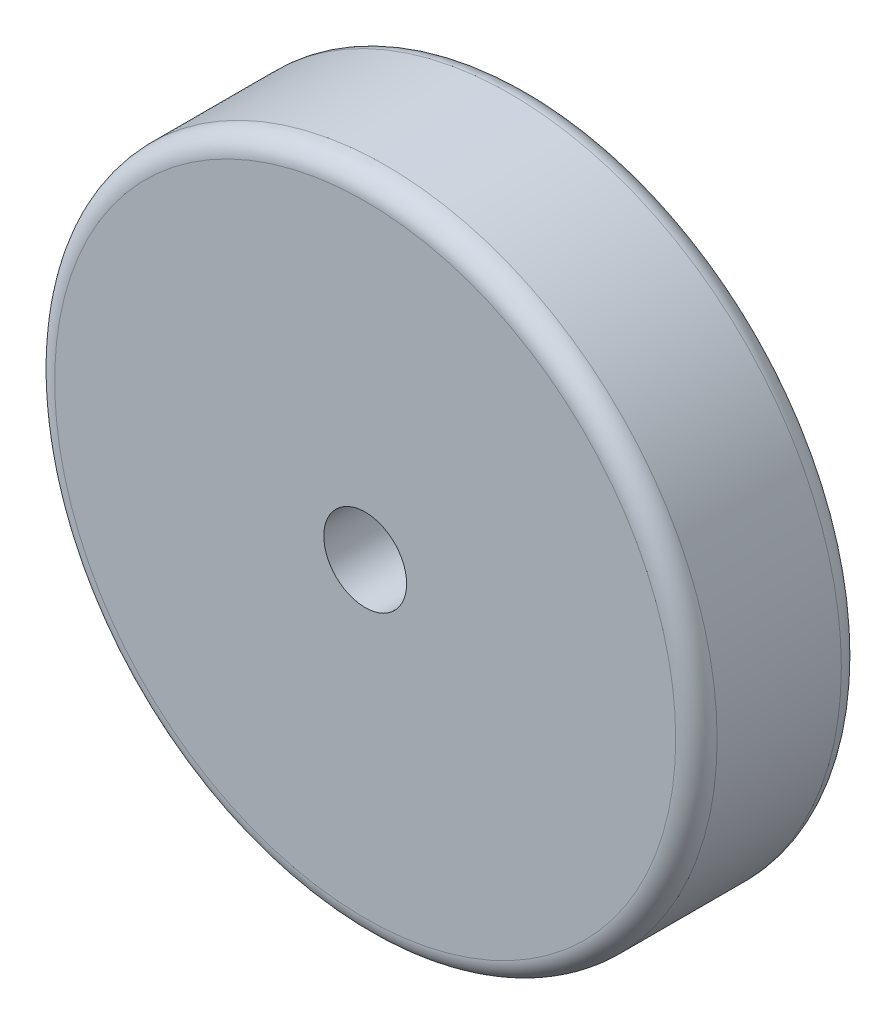
ISO-10303-21;
HEADER;
FILE_DESCRIPTION(('STEP AP214'),'2;1');
FILE_NAME('part.step','',(''),(''),'','','');
FILE_SCHEMA(('AUTOMOTIVE_DESIGN { 1 0 10303 214 1 1 1 1 }'));
ENDSEC;
DATA;
#1=APPLICATION_CONTEXT('core data for automotive mechanical design processes');
#2=APPLICATION_PROTOCOL_DEFINITION('international standard','automotive_design',2000,#1);
#3=PRODUCT_CONTEXT('',#1,'mechanical');
#4=PRODUCT('Part','Part','',(#3));
#5=PRODUCT_RELATED_PRODUCT_CATEGORY('part','',(#4));
#6=PRODUCT_DEFINITION_FORMATION('','',#4);
#7=PRODUCT_DEFINITION_CONTEXT('part definition',#1,'design');
#8=PRODUCT_DEFINITION('design','',#6,#7);
#9=PRODUCT_DEFINITION_SHAPE('','',#8);
#10=(LENGTH_UNIT() NAMED_UNIT(*) SI_UNIT(.MILLI.,.METRE.));
#11=(NAMED_UNIT(*) PLANE_ANGLE_UNIT() SI_UNIT($,.RADIAN.));
#12=(NAMED_UNIT(*) SI_UNIT($,.STERADIAN.) SOLID_ANGLE_UNIT());
#13=UNCERTAINTY_MEASURE_WITH_UNIT(LENGTH_MEASURE(1.E-05),#10,'distance_accuracy_value','');
#14=(GEOMETRIC_REPRESENTATION_CONTEXT(3) GLOBAL_UNCERTAINTY_ASSIGNED_CONTEXT((#13)) GLOBAL_UNIT_ASSIGNED_CONTEXT((#10,
#11,#12)) REPRESENTATION_CONTEXT('',''));
#15=CARTESIAN_POINT('',(0.,0.,0.));
#16=DIRECTION('',(0.,0.,1.));
#17=DIRECTION('',(1.,0.,0.));
#18=AXIS2_PLACEMENT_3D('',#15,#16,#17);
#19=CARTESIAN_POINT('',(0.,0.,2.));
#20=DIRECTION('',(0.,0.,1.));
#21=DIRECTION('',(1.,0.,0.));
#22=AXIS2_PLACEMENT_3D('',#19,#20,#21);
#23=PLANE('',#22);
#24=CARTESIAN_POINT('',(0.,0.,2.));
#25=DIRECTION('',(0.,0.,1.));
#26=DIRECTION('',(1.,0.,0.));
#27=AXIS2_PLACEMENT_3D('',#24,#25,#26);
#28=CIRCLE('',#27,3.75);
#29=CARTESIAN_POINT('',(3.75,0.,2.));
#30=VERTEX_POINT('',#29);
#31=EDGE_CURVE('E10',#30,#30,#28,.T.);
#32=ORIENTED_EDGE('',*,*,#31,.T.);
#33=EDGE_LOOP('',(#32));
#34=FACE_BOUND('',#33,.T.);
#35=CARTESIAN_POINT('',(0.,0.,2.));
#36=DIRECTION('',(0.,0.,1.));
#37=DIRECTION('',(1.,0.,0.));
#38=AXIS2_PLACEMENT_3D('',#35,#36,#37);
#39=CIRCLE('',#38,0.5);
#40=CARTESIAN_POINT('',(0.5,0.,2.));
#41=VERTEX_POINT('',#40);
#42=EDGE_CURVE('E51',#41,#41,#39,.T.);
#43=ORIENTED_EDGE('',*,*,#42,.F.);
#44=EDGE_LOOP('',(#43));
#45=FACE_BOUND('',#44,.T.);
#46=ADVANCED_FACE('F31',(#34,#45),#23,.T.);
#47=CARTESIAN_POINT('',(0.,0.,0.));
#48=DIRECTION('',(0.,0.,1.));
#49=DIRECTION('',(1.,0.,0.));
#50=AXIS2_PLACEMENT_3D('',#47,#48,#49);
#51=PLANE('',#50);
#52=CARTESIAN_POINT('',(0.,0.,0.));
#53=DIRECTION('',(0.,0.,1.));
#54=DIRECTION('',(1.,0.,0.));
#55=AXIS2_PLACEMENT_3D('',#52,#53,#54);
#56=CIRCLE('',#55,3.75);
#57=CARTESIAN_POINT('',(3.75,0.,0.));
#58=VERTEX_POINT('',#57);
#59=EDGE_CURVE('E38',#58,#58,#56,.F.);
#60=ORIENTED_EDGE('',*,*,#59,.T.);
#61=EDGE_LOOP('',(#60));
#62=FACE_BOUND('',#61,.T.);
#63=CARTESIAN_POINT('',(0.,0.,0.));
#64=DIRECTION('',(0.,0.,1.));
#65=DIRECTION('',(1.,0.,0.));
#66=AXIS2_PLACEMENT_3D('',#63,#64,#65);
#67=CIRCLE('',#66,0.5);
#68=CARTESIAN_POINT('',(0.5,0.,0.));
#69=VERTEX_POINT('',#68);
#70=EDGE_CURVE('E52',#69,#69,#67,.T.);
#71=ORIENTED_EDGE('',*,*,#70,.T.);
#72=EDGE_LOOP('',(#71));
#73=FACE_BOUND('',#72,.T.);
#74=ADVANCED_FACE('F62',(#62,#73),#51,.F.);
#75=CARTESIAN_POINT('',(0.,0.,2.));
#76=DIRECTION('',(0.,0.,-1.));
#77=DIRECTION('',(-1.,0.,0.));
#78=AXIS2_PLACEMENT_3D('',#75,#76,#77);
#79=CYLINDRICAL_SURFACE('',#78,4.);
#80=CARTESIAN_POINT('',(0.,0.,0.25));
#81=DIRECTION('',(0.,0.,1.));
#82=DIRECTION('',(1.,0.,0.));
#83=AXIS2_PLACEMENT_3D('',#80,#81,#82);
#84=CIRCLE('',#83,4.);
#85=CARTESIAN_POINT('',(4.,0.,0.25));
#86=VERTEX_POINT('',#85);
#87=EDGE_CURVE('E42',#86,#86,#84,.T.);
#88=ORIENTED_EDGE('',*,*,#87,.T.);
#89=EDGE_LOOP('',(#88));
#90=FACE_BOUND('',#89,.T.);
#91=CARTESIAN_POINT('',(0.,0.,1.75));
#92=DIRECTION('',(0.,0.,1.));
#93=DIRECTION('',(1.,0.,0.));
#94=AXIS2_PLACEMENT_3D('',#91,#92,#93);
#95=CIRCLE('',#94,4.);
#96=CARTESIAN_POINT('',(4.,0.,1.75));
#97=VERTEX_POINT('',#96);
#98=EDGE_CURVE('E46',#97,#97,#95,.F.);
#99=ORIENTED_EDGE('',*,*,#98,.T.);
#100=EDGE_LOOP('',(#99));
#101=FACE_BOUND('',#100,.T.);
#102=ADVANCED_FACE('F67',(#90,#101),#79,.T.);
#103=CARTESIAN_POINT('',(0.,0.,2.));
#104=DIRECTION('',(0.,0.,-1.));
#105=DIRECTION('',(-1.,0.,0.));
#106=AXIS2_PLACEMENT_3D('',#103,#104,#105);
#107=CYLINDRICAL_SURFACE('',#106,0.5);
#108=ORIENTED_EDGE('',*,*,#42,.T.);
#109=EDGE_LOOP('',(#108));
#110=FACE_BOUND('',#109,.T.);
#111=ORIENTED_EDGE('',*,*,#70,.F.);
#112=EDGE_LOOP('',(#111));
#113=FACE_BOUND('',#112,.T.);
#114=ADVANCED_FACE('F58',(#110,#113),#107,.F.);
#115=CARTESIAN_POINT('',(0.,0.,0.25));
#116=DIRECTION('',(0.,0.,1.));
#117=DIRECTION('',(1.,0.,0.));
#118=AXIS2_PLACEMENT_3D('',#115,#116,#117);
#119=TOROIDAL_SURFACE('',#118,3.75,0.25);
#120=ORIENTED_EDGE('',*,*,#59,.F.);
#121=EDGE_LOOP('',(#120));
#122=FACE_BOUND('',#121,.T.);
#123=ORIENTED_EDGE('',*,*,#87,.F.);
#124=EDGE_LOOP('',(#123));
#125=FACE_BOUND('',#124,.T.);
#126=ADVANCED_FACE('F73',(#122,#125),#119,.T.);
#127=CARTESIAN_POINT('',(0.,0.,1.75));
#128=DIRECTION('',(0.,0.,1.));
#129=DIRECTION('',(1.,0.,0.));
#130=AXIS2_PLACEMENT_3D('',#127,#128,#129);
#131=TOROIDAL_SURFACE('',#130,3.75,0.25);
#132=ORIENTED_EDGE('',*,*,#98,.F.);
#133=EDGE_LOOP('',(#132));
#134=FACE_BOUND('',#133,.T.);
#135=ORIENTED_EDGE('',*,*,#31,.F.);
#136=EDGE_LOOP('',(#135));
#137=FACE_BOUND('',#136,.T.);
#138=ADVANCED_FACE('F33',(#134,#137),#131,.T.);
#139=CLOSED_SHELL('',(#46,#74,#102,#114,#126,#138));
#140=MANIFOLD_SOLID_BREP('B2',#139);
#141=ADVANCED_BREP_SHAPE_REPRESENTATION('',(#18,#140),#14);
#142=SHAPE_DEFINITION_REPRESENTATION(#9,#141);
ENDSEC;
END-ISO-10303-21;
